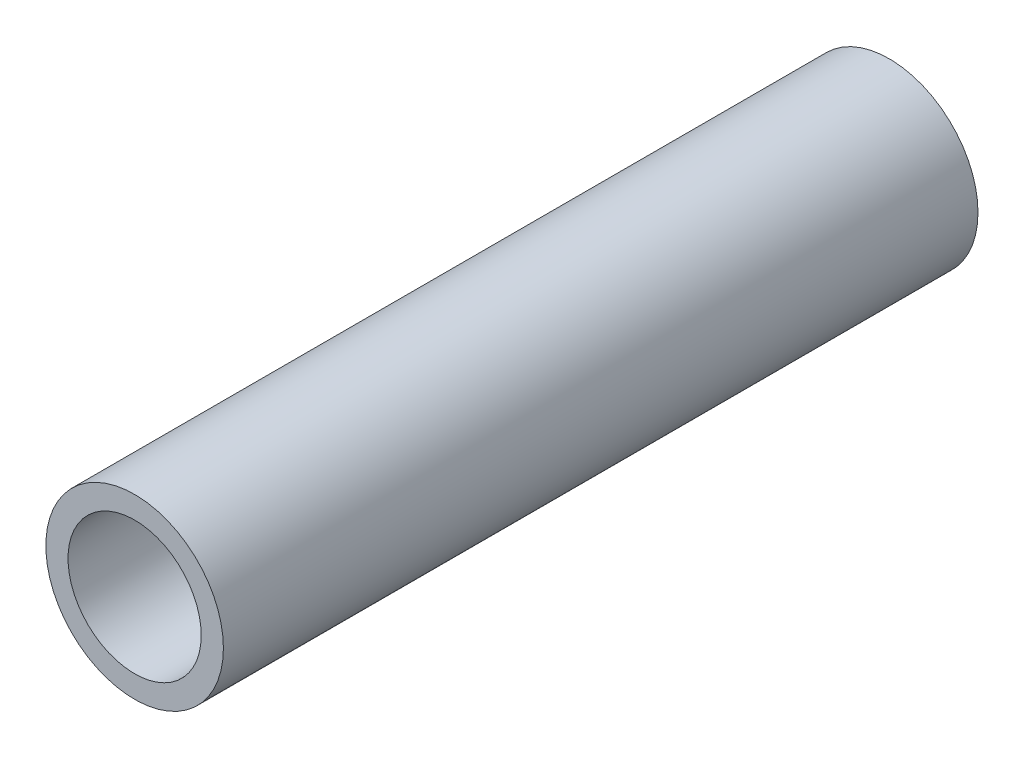
ISO-10303-21;
HEADER;
FILE_DESCRIPTION(('STEP AP214'),'2;1');
FILE_NAME('part.step','',(''),(''),'','','');
FILE_SCHEMA(('AUTOMOTIVE_DESIGN { 1 0 10303 214 1 1 1 1 }'));
ENDSEC;
DATA;
#1=APPLICATION_CONTEXT('core data for automotive mechanical design processes');
#2=APPLICATION_PROTOCOL_DEFINITION('international standard','automotive_design',2000,#1);
#3=PRODUCT_CONTEXT('',#1,'mechanical');
#4=PRODUCT('Part','Part','',(#3));
#5=PRODUCT_RELATED_PRODUCT_CATEGORY('part','',(#4));
#6=PRODUCT_DEFINITION_FORMATION('','',#4);
#7=PRODUCT_DEFINITION_CONTEXT('part definition',#1,'design');
#8=PRODUCT_DEFINITION('design','',#6,#7);
#9=PRODUCT_DEFINITION_SHAPE('','',#8);
#10=(LENGTH_UNIT() NAMED_UNIT(*) SI_UNIT(.MILLI.,.METRE.));
#11=(NAMED_UNIT(*) PLANE_ANGLE_UNIT() SI_UNIT($,.RADIAN.));
#12=(NAMED_UNIT(*) SI_UNIT($,.STERADIAN.) SOLID_ANGLE_UNIT());
#13=UNCERTAINTY_MEASURE_WITH_UNIT(LENGTH_MEASURE(1.E-05),#10,'distance_accuracy_value','');
#14=(GEOMETRIC_REPRESENTATION_CONTEXT(3) GLOBAL_UNCERTAINTY_ASSIGNED_CONTEXT((#13)) GLOBAL_UNIT_ASSIGNED_CONTEXT((#10,
#11,#12)) REPRESENTATION_CONTEXT('',''));
#15=CARTESIAN_POINT('',(0.,0.,0.));
#16=DIRECTION('',(0.,0.,1.));
#17=DIRECTION('',(1.,0.,0.));
#18=AXIS2_PLACEMENT_3D('',#15,#16,#17);
#19=CARTESIAN_POINT('',(0.,0.,17.));
#20=DIRECTION('',(0.,0.,1.));
#21=DIRECTION('',(1.,0.,0.));
#22=AXIS2_PLACEMENT_3D('',#19,#20,#21);
#23=PLANE('',#22);
#24=CARTESIAN_POINT('',(0.,0.,17.));
#25=DIRECTION('',(0.,0.,1.));
#26=DIRECTION('',(1.,0.,0.));
#27=AXIS2_PLACEMENT_3D('',#24,#25,#26);
#28=CIRCLE('',#27,2.);
#29=CARTESIAN_POINT('',(2.,0.,17.));
#30=VERTEX_POINT('',#29);
#31=EDGE_CURVE('E10',#30,#30,#28,.T.);
#32=ORIENTED_EDGE('',*,*,#31,.T.);
#33=EDGE_LOOP('',(#32));
#34=FACE_BOUND('',#33,.T.);
#35=CARTESIAN_POINT('',(0.,0.,17.));
#36=DIRECTION('',(0.,0.,1.));
#37=DIRECTION('',(1.,0.,0.));
#38=AXIS2_PLACEMENT_3D('',#35,#36,#37);
#39=CIRCLE('',#38,1.5);
#40=CARTESIAN_POINT('',(1.5,0.,17.));
#41=VERTEX_POINT('',#40);
#42=EDGE_CURVE('E45',#41,#41,#39,.T.);
#43=ORIENTED_EDGE('',*,*,#42,.F.);
#44=EDGE_LOOP('',(#43));
#45=FACE_BOUND('',#44,.T.);
#46=ADVANCED_FACE('F34',(#34,#45),#23,.T.);
#47=CARTESIAN_POINT('',(0.,0.,0.));
#48=DIRECTION('',(0.,0.,1.));
#49=DIRECTION('',(1.,0.,0.));
#50=AXIS2_PLACEMENT_3D('',#47,#48,#49);
#51=PLANE('',#50);
#52=CARTESIAN_POINT('',(0.,0.,0.));
#53=DIRECTION('',(0.,0.,1.));
#54=DIRECTION('',(1.,0.,0.));
#55=AXIS2_PLACEMENT_3D('',#52,#53,#54);
#56=CIRCLE('',#55,2.);
#57=CARTESIAN_POINT('',(2.,0.,0.));
#58=VERTEX_POINT('',#57);
#59=EDGE_CURVE('E38',#58,#58,#56,.T.);
#60=ORIENTED_EDGE('',*,*,#59,.F.);
#61=EDGE_LOOP('',(#60));
#62=FACE_BOUND('',#61,.T.);
#63=CARTESIAN_POINT('',(0.,0.,0.));
#64=DIRECTION('',(0.,0.,1.));
#65=DIRECTION('',(1.,0.,0.));
#66=AXIS2_PLACEMENT_3D('',#63,#64,#65);
#67=CIRCLE('',#66,1.5);
#68=CARTESIAN_POINT('',(1.5,0.,0.));
#69=VERTEX_POINT('',#68);
#70=EDGE_CURVE('E47',#69,#69,#67,.T.);
#71=ORIENTED_EDGE('',*,*,#70,.T.);
#72=EDGE_LOOP('',(#71));
#73=FACE_BOUND('',#72,.T.);
#74=ADVANCED_FACE('F57',(#62,#73),#51,.F.);
#75=CARTESIAN_POINT('',(0.,0.,17.));
#76=DIRECTION('',(0.,0.,-1.));
#77=DIRECTION('',(-1.,0.,0.));
#78=AXIS2_PLACEMENT_3D('',#75,#76,#77);
#79=CYLINDRICAL_SURFACE('',#78,2.);
#80=ORIENTED_EDGE('',*,*,#31,.F.);
#81=EDGE_LOOP('',(#80));
#82=FACE_BOUND('',#81,.T.);
#83=ORIENTED_EDGE('',*,*,#59,.T.);
#84=EDGE_LOOP('',(#83));
#85=FACE_BOUND('',#84,.T.);
#86=ADVANCED_FACE('F36',(#82,#85),#79,.T.);
#87=CARTESIAN_POINT('',(0.,0.,17.));
#88=DIRECTION('',(0.,0.,-1.));
#89=DIRECTION('',(-1.,0.,0.));
#90=AXIS2_PLACEMENT_3D('',#87,#88,#89);
#91=CYLINDRICAL_SURFACE('',#90,1.5);
#92=ORIENTED_EDGE('',*,*,#42,.T.);
#93=EDGE_LOOP('',(#92));
#94=FACE_BOUND('',#93,.T.);
#95=ORIENTED_EDGE('',*,*,#70,.F.);
#96=EDGE_LOOP('',(#95));
#97=FACE_BOUND('',#96,.T.);
#98=ADVANCED_FACE('F53',(#94,#97),#91,.F.);
#99=CLOSED_SHELL('',(#46,#74,#86,#98));
#100=MANIFOLD_SOLID_BREP('B2',#99);
#101=ADVANCED_BREP_SHAPE_REPRESENTATION('',(#18,#100),#14);
#102=SHAPE_DEFINITION_REPRESENTATION(#9,#101);
ENDSEC;
END-ISO-10303-21;
